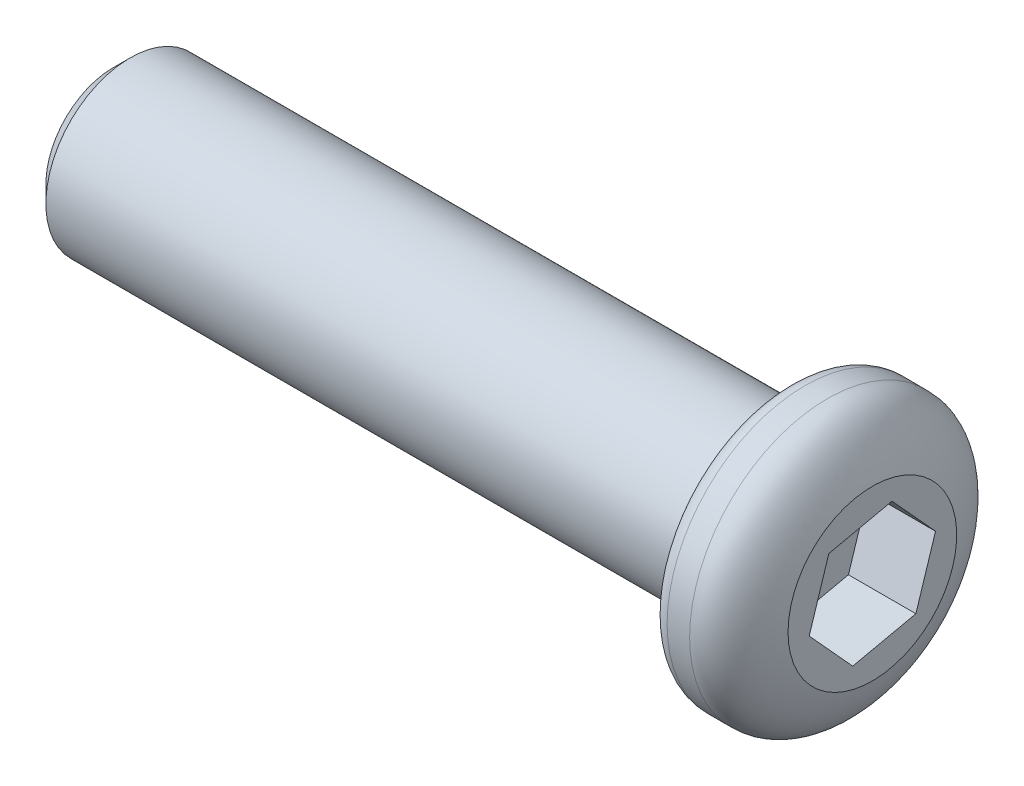
ISO-10303-21;
HEADER;
FILE_DESCRIPTION(('STEP AP214'),'2;1');
FILE_NAME('part.step','',(''),(''),'','','');
FILE_SCHEMA(('AUTOMOTIVE_DESIGN { 1 0 10303 214 1 1 1 1 }'));
ENDSEC;
DATA;
#1=APPLICATION_CONTEXT('core data for automotive mechanical design processes');
#2=APPLICATION_PROTOCOL_DEFINITION('international standard','automotive_design',2000,#1);
#3=PRODUCT_CONTEXT('',#1,'mechanical');
#4=PRODUCT('Part','Part','',(#3));
#5=PRODUCT_RELATED_PRODUCT_CATEGORY('part','',(#4));
#6=PRODUCT_DEFINITION_FORMATION('','',#4);
#7=PRODUCT_DEFINITION_CONTEXT('part definition',#1,'design');
#8=PRODUCT_DEFINITION('design','',#6,#7);
#9=PRODUCT_DEFINITION_SHAPE('','',#8);
#10=(LENGTH_UNIT() NAMED_UNIT(*) SI_UNIT(.MILLI.,.METRE.));
#11=(NAMED_UNIT(*) PLANE_ANGLE_UNIT() SI_UNIT($,.RADIAN.));
#12=(NAMED_UNIT(*) SI_UNIT($,.STERADIAN.) SOLID_ANGLE_UNIT());
#13=UNCERTAINTY_MEASURE_WITH_UNIT(LENGTH_MEASURE(1.E-05),#10,'distance_accuracy_value','');
#14=(GEOMETRIC_REPRESENTATION_CONTEXT(3) GLOBAL_UNCERTAINTY_ASSIGNED_CONTEXT((#13)) GLOBAL_UNIT_ASSIGNED_CONTEXT((#10,
#11,#12)) REPRESENTATION_CONTEXT('',''));
#15=CARTESIAN_POINT('',(0.,0.,0.));
#16=DIRECTION('',(0.,0.,1.));
#17=DIRECTION('',(1.,0.,0.));
#18=AXIS2_PLACEMENT_3D('',#15,#16,#17);
#19=CARTESIAN_POINT('',(13.5,0.,-1.5));
#20=DIRECTION('',(-1.,0.,0.));
#21=DIRECTION('',(0.,0.,1.));
#22=AXIS2_PLACEMENT_3D('',#19,#20,#21);
#23=PLANE('',#22);
#24=DIRECTION('',(0.,-0.213323623316259,0.976981592321587));
#25=VECTOR('',#24,1.);
#26=CARTESIAN_POINT('',(13.5,1.09566559308416,-0.349309187012806));
#27=LINE('',#26,#25);
#28=CARTESIAN_POINT('',(13.5,1.09566559308416,-0.349309187012806));
#29=VERTEX_POINT('',#28);
#30=CARTESIAN_POINT('',(13.5,0.850343426270457,0.774219644157019));
#31=VERTEX_POINT('',#30);
#32=EDGE_CURVE('E121',#29,#31,#27,.T.);
#33=ORIENTED_EDGE('',*,*,#32,.F.);
#34=DIRECTION('',(0.,0.739429066322136,0.673234473180016));
#35=VECTOR('',#34,1.);
#36=CARTESIAN_POINT('',(13.5,0.245322166813698,-1.12352883116982));
#37=LINE('',#36,#35);
#38=CARTESIAN_POINT('',(13.5,0.245322166813698,-1.12352883116982));
#39=VERTEX_POINT('',#38);
#40=EDGE_CURVE('E47',#39,#29,#37,.T.);
#41=ORIENTED_EDGE('',*,*,#40,.F.);
#42=DIRECTION('',(0.,0.952752689638395,-0.303747119141571));
#43=VECTOR('',#42,1.);
#44=CARTESIAN_POINT('',(13.5,-0.850343426270457,-0.774219644157018));
#45=LINE('',#44,#43);
#46=CARTESIAN_POINT('',(13.5,-0.850343426270457,-0.774219644157018));
#47=VERTEX_POINT('',#46);
#48=EDGE_CURVE('E130',#47,#39,#45,.T.);
#49=ORIENTED_EDGE('',*,*,#48,.F.);
#50=DIRECTION('',(0.,0.213323623316259,-0.976981592321587));
#51=VECTOR('',#50,1.);
#52=CARTESIAN_POINT('',(13.5,-1.09566559308415,0.349309187012806));
#53=LINE('',#52,#51);
#54=CARTESIAN_POINT('',(13.5,-1.09566559308415,0.349309187012806));
#55=VERTEX_POINT('',#54);
#56=EDGE_CURVE('E128',#55,#47,#53,.T.);
#57=ORIENTED_EDGE('',*,*,#56,.F.);
#58=DIRECTION('',(0.,-0.739429066322136,-0.673234473180016));
#59=VECTOR('',#58,1.);
#60=CARTESIAN_POINT('',(13.5,-0.245322166813698,1.12352883116982));
#61=LINE('',#60,#59);
#62=CARTESIAN_POINT('',(13.5,-0.245322166813698,1.12352883116982));
#63=VERTEX_POINT('',#62);
#64=EDGE_CURVE('E95',#63,#55,#61,.T.);
#65=ORIENTED_EDGE('',*,*,#64,.F.);
#66=DIRECTION('',(0.,-0.952752689638395,0.30374711914157));
#67=VECTOR('',#66,1.);
#68=CARTESIAN_POINT('',(13.5,0.850343426270457,0.774219644157019));
#69=LINE('',#68,#67);
#70=EDGE_CURVE('E124',#31,#63,#69,.T.);
#71=ORIENTED_EDGE('',*,*,#70,.F.);
#72=EDGE_LOOP('',(#33,#41,#49,#57,#65,#71));
#73=FACE_BOUND('',#72,.T.);
#74=CARTESIAN_POINT('',(13.5,0.,0.));
#75=DIRECTION('',(-1.,0.,0.));
#76=DIRECTION('',(0.,0.,1.));
#77=AXIS2_PLACEMENT_3D('',#74,#75,#76);
#78=CIRCLE('',#77,1.5);
#79=CARTESIAN_POINT('',(13.5,0.,1.5));
#80=VERTEX_POINT('',#79);
#81=EDGE_CURVE('E186',#80,#80,#78,.T.);
#82=ORIENTED_EDGE('',*,*,#81,.F.);
#83=EDGE_LOOP('',(#82));
#84=FACE_BOUND('',#83,.T.);
#85=ADVANCED_FACE('F32',(#73,#84),#23,.F.);
#86=CARTESIAN_POINT('',(13.5,0.,-1.5));
#87=CARTESIAN_POINT('',(13.1904427483468,0.,-2.48461827937574));
#88=CARTESIAN_POINT('',(12.7,0.,-2.45));
#89=B_SPLINE_CURVE_WITH_KNOTS('',2,(#86,#87,#88),.UNSPECIFIED.,.F.,.F.,(3,3),(0.,
0.615019669126218),.UNSPECIFIED.);
#90=CARTESIAN_POINT('',(-60.7109511079297,0.,0.));
#91=DIRECTION('',(-1.,0.,0.));
#92=AXIS1_PLACEMENT('',#90,#91);
#93=SURFACE_OF_REVOLUTION('',#89,#92);
#94=CARTESIAN_POINT('',(12.7,0.,0.));
#95=DIRECTION('',(-1.,0.,0.));
#96=DIRECTION('',(0.,0.,1.));
#97=AXIS2_PLACEMENT_3D('',#94,#95,#96);
#98=CIRCLE('',#97,2.45);
#99=CARTESIAN_POINT('',(12.7,0.,2.45));
#100=VERTEX_POINT('',#99);
#101=EDGE_CURVE('E134',#100,#100,#98,.T.);
#102=ORIENTED_EDGE('',*,*,#101,.F.);
#103=EDGE_LOOP('',(#102));
#104=FACE_BOUND('',#103,.T.);
#105=ORIENTED_EDGE('',*,*,#81,.T.);
#106=EDGE_LOOP('',(#105));
#107=FACE_BOUND('',#106,.T.);
#108=ADVANCED_FACE('F149',(#104,#107),#93,.T.);
#109=CARTESIAN_POINT('',(-60.7109511079297,0.,0.));
#110=DIRECTION('',(-1.,0.,0.));
#111=DIRECTION('',(0.,0.,1.));
#112=AXIS2_PLACEMENT_3D('',#109,#110,#111);
#113=CYLINDRICAL_SURFACE('',#112,2.45);
#114=CARTESIAN_POINT('',(12.3,0.,0.));
#115=DIRECTION('',(1.,0.,0.));
#116=DIRECTION('',(0.,0.,-1.));
#117=AXIS2_PLACEMENT_3D('',#114,#115,#116);
#118=CIRCLE('',#117,2.45);
#119=CARTESIAN_POINT('',(12.3,0.,-2.45));
#120=VERTEX_POINT('',#119);
#121=EDGE_CURVE('E11',#120,#120,#118,.T.);
#122=ORIENTED_EDGE('',*,*,#121,.T.);
#123=EDGE_LOOP('',(#122));
#124=FACE_BOUND('',#123,.T.);
#125=ORIENTED_EDGE('',*,*,#101,.T.);
#126=EDGE_LOOP('',(#125));
#127=FACE_BOUND('',#126,.T.);
#128=ADVANCED_FACE('F153',(#124,#127),#113,.T.);
#129=CARTESIAN_POINT('',(12.,0.,-1.5));
#130=DIRECTION('',(1.,0.,0.));
#131=DIRECTION('',(0.,0.,-1.));
#132=AXIS2_PLACEMENT_3D('',#129,#130,#131);
#133=PLANE('',#132);
#134=CARTESIAN_POINT('',(12.,0.,0.));
#135=DIRECTION('',(1.,0.,0.));
#136=DIRECTION('',(0.,0.,-1.));
#137=AXIS2_PLACEMENT_3D('',#134,#135,#136);
#138=CIRCLE('',#137,2.15);
#139=CARTESIAN_POINT('',(12.,0.,-2.15));
#140=VERTEX_POINT('',#139);
#141=EDGE_CURVE('E40',#140,#140,#138,.F.);
#142=ORIENTED_EDGE('',*,*,#141,.T.);
#143=EDGE_LOOP('',(#142));
#144=FACE_BOUND('',#143,.T.);
#145=CARTESIAN_POINT('',(12.,0.,0.));
#146=DIRECTION('',(1.,0.,0.));
#147=DIRECTION('',(0.,0.,-1.));
#148=AXIS2_PLACEMENT_3D('',#145,#146,#147);
#149=CIRCLE('',#148,1.80000000000001);
#150=CARTESIAN_POINT('',(12.,0.,-1.80000000000001));
#151=VERTEX_POINT('',#150);
#152=EDGE_CURVE('E177',#151,#151,#149,.T.);
#153=ORIENTED_EDGE('',*,*,#152,.T.);
#154=EDGE_LOOP('',(#153));
#155=FACE_BOUND('',#154,.T.);
#156=ADVANCED_FACE('F194',(#144,#155),#133,.F.);
#157=CARTESIAN_POINT('',(-60.7109511079297,0.,0.));
#158=DIRECTION('',(-1.,0.,0.));
#159=DIRECTION('',(0.,0.,1.));
#160=AXIS2_PLACEMENT_3D('',#157,#158,#159);
#161=CYLINDRICAL_SURFACE('',#160,1.5);
#162=CARTESIAN_POINT('',(11.7,0.,0.));
#163=DIRECTION('',(1.,0.,0.));
#164=DIRECTION('',(0.,0.,-1.));
#165=AXIS2_PLACEMENT_3D('',#162,#163,#164);
#166=CIRCLE('',#165,1.5);
#167=CARTESIAN_POINT('',(11.7,0.,-1.5));
#168=VERTEX_POINT('',#167);
#169=EDGE_CURVE('E181',#168,#168,#166,.F.);
#170=ORIENTED_EDGE('',*,*,#169,.T.);
#171=EDGE_LOOP('',(#170));
#172=FACE_BOUND('',#171,.T.);
#173=CARTESIAN_POINT('',(0.300000000000002,0.,0.));
#174=DIRECTION('',(1.,0.,0.));
#175=DIRECTION('',(0.,0.,-1.));
#176=AXIS2_PLACEMENT_3D('',#173,#174,#175);
#177=CIRCLE('',#176,1.5);
#178=CARTESIAN_POINT('',(0.300000000000002,0.,-1.5));
#179=VERTEX_POINT('',#178);
#180=EDGE_CURVE('E172',#179,#179,#177,.T.);
#181=ORIENTED_EDGE('',*,*,#180,.T.);
#182=EDGE_LOOP('',(#181));
#183=FACE_BOUND('',#182,.T.);
#184=ADVANCED_FACE('F199',(#172,#183),#161,.T.);
#185=CARTESIAN_POINT('',(0.,0.,0.));
#186=DIRECTION('',(1.,0.,0.));
#187=DIRECTION('',(0.,0.,-1.));
#188=AXIS2_PLACEMENT_3D('',#185,#186,#187);
#189=PLANE('',#188);
#190=CARTESIAN_POINT('',(0.,0.,0.));
#191=DIRECTION('',(1.,0.,0.));
#192=DIRECTION('',(0.,0.,-1.));
#193=AXIS2_PLACEMENT_3D('',#190,#191,#192);
#194=CIRCLE('',#193,1.2);
#195=CARTESIAN_POINT('',(0.,0.,-1.2));
#196=VERTEX_POINT('',#195);
#197=EDGE_CURVE('E175',#196,#196,#194,.F.);
#198=ORIENTED_EDGE('',*,*,#197,.T.);
#199=EDGE_LOOP('',(#198));
#200=FACE_BOUND('',#199,.T.);
#201=ADVANCED_FACE('F211',(#200),#189,.F.);
#202=CARTESIAN_POINT('',(12.3,0.245322166813698,-1.12352883116982));
#203=DIRECTION('',(0.,0.673234473180016,-0.739429066322136));
#204=DIRECTION('',(0.,0.739429066322136,0.673234473180016));
#205=AXIS2_PLACEMENT_3D('',#202,#203,#204);
#206=PLANE('',#205);
#207=ORIENTED_EDGE('',*,*,#40,.T.);
#208=DIRECTION('',(1.,0.,0.));
#209=VECTOR('',#208,1.);
#210=CARTESIAN_POINT('',(12.3,1.09566559308416,-0.349309187012806));
#211=LINE('',#210,#209);
#212=CARTESIAN_POINT('',(12.3,1.09566559308416,-0.349309187012806));
#213=VERTEX_POINT('',#212);
#214=EDGE_CURVE('E77',#213,#29,#211,.T.);
#215=ORIENTED_EDGE('',*,*,#214,.F.);
#216=DIRECTION('',(0.,0.739429066322136,0.673234473180016));
#217=VECTOR('',#216,1.);
#218=CARTESIAN_POINT('',(12.3,0.245322166813698,-1.12352883116982));
#219=LINE('',#218,#217);
#220=CARTESIAN_POINT('',(12.3,0.245322166813698,-1.12352883116982));
#221=VERTEX_POINT('',#220);
#222=EDGE_CURVE('E132',#221,#213,#219,.T.);
#223=ORIENTED_EDGE('',*,*,#222,.F.);
#224=DIRECTION('',(1.,0.,0.));
#225=VECTOR('',#224,1.);
#226=CARTESIAN_POINT('',(12.3,0.245322166813698,-1.12352883116982));
#227=LINE('',#226,#225);
#228=EDGE_CURVE('E55',#221,#39,#227,.T.);
#229=ORIENTED_EDGE('',*,*,#228,.T.);
#230=EDGE_LOOP('',(#207,#215,#223,#229));
#231=FACE_BOUND('',#230,.T.);
#232=ADVANCED_FACE('F216',(#231),#206,.F.);
#233=CARTESIAN_POINT('',(12.3,-0.850343426270457,-0.774219644157018));
#234=DIRECTION('',(0.,-0.303747119141571,-0.952752689638395));
#235=DIRECTION('',(0.,0.952752689638396,-0.303747119141571));
#236=AXIS2_PLACEMENT_3D('',#233,#234,#235);
#237=PLANE('',#236);
#238=ORIENTED_EDGE('',*,*,#48,.T.);
#239=ORIENTED_EDGE('',*,*,#228,.F.);
#240=DIRECTION('',(0.,0.952752689638395,-0.303747119141571));
#241=VECTOR('',#240,1.);
#242=CARTESIAN_POINT('',(12.3,-0.850343426270457,-0.774219644157018));
#243=LINE('',#242,#241);
#244=CARTESIAN_POINT('',(12.3,-0.850343426270457,-0.774219644157018));
#245=VERTEX_POINT('',#244);
#246=EDGE_CURVE('E107',#245,#221,#243,.T.);
#247=ORIENTED_EDGE('',*,*,#246,.F.);
#248=DIRECTION('',(1.,0.,0.));
#249=VECTOR('',#248,1.);
#250=CARTESIAN_POINT('',(12.3,-0.850343426270457,-0.774219644157018));
#251=LINE('',#250,#249);
#252=EDGE_CURVE('E99',#245,#47,#251,.T.);
#253=ORIENTED_EDGE('',*,*,#252,.T.);
#254=EDGE_LOOP('',(#238,#239,#247,#253));
#255=FACE_BOUND('',#254,.T.);
#256=ADVANCED_FACE('F221',(#255),#237,.F.);
#257=CARTESIAN_POINT('',(12.3,-1.09566559308415,0.349309187012806));
#258=DIRECTION('',(0.,-0.976981592321587,-0.213323623316259));
#259=DIRECTION('',(0.,0.213323623316259,-0.976981592321587));
#260=AXIS2_PLACEMENT_3D('',#257,#258,#259);
#261=PLANE('',#260);
#262=ORIENTED_EDGE('',*,*,#56,.T.);
#263=ORIENTED_EDGE('',*,*,#252,.F.);
#264=DIRECTION('',(0.,0.213323623316259,-0.976981592321587));
#265=VECTOR('',#264,1.);
#266=CARTESIAN_POINT('',(12.3,-1.09566559308415,0.349309187012806));
#267=LINE('',#266,#265);
#268=CARTESIAN_POINT('',(12.3,-1.09566559308415,0.349309187012806));
#269=VERTEX_POINT('',#268);
#270=EDGE_CURVE('E103',#269,#245,#267,.T.);
#271=ORIENTED_EDGE('',*,*,#270,.F.);
#272=DIRECTION('',(1.,0.,0.));
#273=VECTOR('',#272,1.);
#274=CARTESIAN_POINT('',(12.3,-1.09566559308415,0.349309187012806));
#275=LINE('',#274,#273);
#276=EDGE_CURVE('E88',#269,#55,#275,.T.);
#277=ORIENTED_EDGE('',*,*,#276,.T.);
#278=EDGE_LOOP('',(#262,#263,#271,#277));
#279=FACE_BOUND('',#278,.T.);
#280=ADVANCED_FACE('F104',(#279),#261,.F.);
#281=CARTESIAN_POINT('',(12.3,-0.245322166813698,1.12352883116982));
#282=DIRECTION('',(0.,-0.673234473180016,0.739429066322136));
#283=DIRECTION('',(0.,-0.739429066322136,-0.673234473180016));
#284=AXIS2_PLACEMENT_3D('',#281,#282,#283);
#285=PLANE('',#284);
#286=ORIENTED_EDGE('',*,*,#64,.T.);
#287=ORIENTED_EDGE('',*,*,#276,.F.);
#288=DIRECTION('',(0.,-0.739429066322136,-0.673234473180016));
#289=VECTOR('',#288,1.);
#290=CARTESIAN_POINT('',(12.3,-0.245322166813698,1.12352883116982));
#291=LINE('',#290,#289);
#292=CARTESIAN_POINT('',(12.3,-0.245322166813698,1.12352883116982));
#293=VERTEX_POINT('',#292);
#294=EDGE_CURVE('E92',#293,#269,#291,.T.);
#295=ORIENTED_EDGE('',*,*,#294,.F.);
#296=DIRECTION('',(1.,0.,0.));
#297=VECTOR('',#296,1.);
#298=CARTESIAN_POINT('',(12.3,-0.245322166813698,1.12352883116982));
#299=LINE('',#298,#297);
#300=EDGE_CURVE('E100',#293,#63,#299,.T.);
#301=ORIENTED_EDGE('',*,*,#300,.T.);
#302=EDGE_LOOP('',(#286,#287,#295,#301));
#303=FACE_BOUND('',#302,.T.);
#304=ADVANCED_FACE('F90',(#303),#285,.F.);
#305=CARTESIAN_POINT('',(12.3,0.850343426270457,0.774219644157019));
#306=DIRECTION('',(0.,0.30374711914157,0.952752689638395));
#307=DIRECTION('',(0.,-0.952752689638396,0.30374711914157));
#308=AXIS2_PLACEMENT_3D('',#305,#306,#307);
#309=PLANE('',#308);
#310=ORIENTED_EDGE('',*,*,#70,.T.);
#311=ORIENTED_EDGE('',*,*,#300,.F.);
#312=DIRECTION('',(0.,-0.952752689638395,0.30374711914157));
#313=VECTOR('',#312,1.);
#314=CARTESIAN_POINT('',(12.3,0.850343426270457,0.774219644157019));
#315=LINE('',#314,#313);
#316=CARTESIAN_POINT('',(12.3,0.850343426270457,0.774219644157019));
#317=VERTEX_POINT('',#316);
#318=EDGE_CURVE('E113',#317,#293,#315,.T.);
#319=ORIENTED_EDGE('',*,*,#318,.F.);
#320=DIRECTION('',(1.,0.,0.));
#321=VECTOR('',#320,1.);
#322=CARTESIAN_POINT('',(12.3,0.850343426270457,0.774219644157019));
#323=LINE('',#322,#321);
#324=EDGE_CURVE('E137',#317,#31,#323,.T.);
#325=ORIENTED_EDGE('',*,*,#324,.T.);
#326=EDGE_LOOP('',(#310,#311,#319,#325));
#327=FACE_BOUND('',#326,.T.);
#328=ADVANCED_FACE('F225',(#327),#309,.F.);
#329=CARTESIAN_POINT('',(12.3,1.09566559308416,-0.349309187012806));
#330=DIRECTION('',(0.,0.976981592321587,0.213323623316259));
#331=DIRECTION('',(0.,-0.213323623316259,0.976981592321587));
#332=AXIS2_PLACEMENT_3D('',#329,#330,#331);
#333=PLANE('',#332);
#334=ORIENTED_EDGE('',*,*,#32,.T.);
#335=ORIENTED_EDGE('',*,*,#324,.F.);
#336=DIRECTION('',(0.,-0.213323623316259,0.976981592321587));
#337=VECTOR('',#336,1.);
#338=CARTESIAN_POINT('',(12.3,1.09566559308416,-0.349309187012806));
#339=LINE('',#338,#337);
#340=EDGE_CURVE('E115',#213,#317,#339,.T.);
#341=ORIENTED_EDGE('',*,*,#340,.F.);
#342=ORIENTED_EDGE('',*,*,#214,.T.);
#343=EDGE_LOOP('',(#334,#335,#341,#342));
#344=FACE_BOUND('',#343,.T.);
#345=ADVANCED_FACE('F222',(#344),#333,.F.);
#346=CARTESIAN_POINT('',(12.3,0.,0.));
#347=DIRECTION('',(1.,0.,0.));
#348=DIRECTION('',(0.,0.,-1.));
#349=AXIS2_PLACEMENT_3D('',#346,#347,#348);
#350=PLANE('',#349);
#351=ORIENTED_EDGE('',*,*,#222,.T.);
#352=ORIENTED_EDGE('',*,*,#340,.T.);
#353=ORIENTED_EDGE('',*,*,#318,.T.);
#354=ORIENTED_EDGE('',*,*,#294,.T.);
#355=ORIENTED_EDGE('',*,*,#270,.T.);
#356=ORIENTED_EDGE('',*,*,#246,.T.);
#357=EDGE_LOOP('',(#351,#352,#353,#354,#355,#356));
#358=FACE_BOUND('',#357,.T.);
#359=ADVANCED_FACE('F110',(#358),#350,.T.);
#360=CARTESIAN_POINT('',(11.7,0.,0.));
#361=DIRECTION('',(1.,0.,0.));
#362=DIRECTION('',(0.,0.,-1.));
#363=AXIS2_PLACEMENT_3D('',#360,#361,#362);
#364=CONICAL_SURFACE('',#363,1.5,0.78539816339745);
#365=ORIENTED_EDGE('',*,*,#152,.F.);
#366=EDGE_LOOP('',(#365));
#367=FACE_BOUND('',#366,.T.);
#368=ORIENTED_EDGE('',*,*,#169,.F.);
#369=EDGE_LOOP('',(#368));
#370=FACE_BOUND('',#369,.T.);
#371=ADVANCED_FACE('F159',(#367,#370),#364,.T.);
#372=CARTESIAN_POINT('',(0.,0.,0.));
#373=DIRECTION('',(1.,0.,0.));
#374=DIRECTION('',(0.,0.,-1.));
#375=AXIS2_PLACEMENT_3D('',#372,#373,#374);
#376=CONICAL_SURFACE('',#375,1.2,0.785398163397446);
#377=ORIENTED_EDGE('',*,*,#180,.F.);
#378=EDGE_LOOP('',(#377));
#379=FACE_BOUND('',#378,.T.);
#380=ORIENTED_EDGE('',*,*,#197,.F.);
#381=EDGE_LOOP('',(#380));
#382=FACE_BOUND('',#381,.T.);
#383=ADVANCED_FACE('F161',(#379,#382),#376,.T.);
#384=CARTESIAN_POINT('',(12.3,0.,0.));
#385=DIRECTION('',(1.,0.,0.));
#386=DIRECTION('',(0.,0.,-1.));
#387=AXIS2_PLACEMENT_3D('',#384,#385,#386);
#388=TOROIDAL_SURFACE('',#387,2.15,0.3);
#389=ORIENTED_EDGE('',*,*,#121,.F.);
#390=EDGE_LOOP('',(#389));
#391=FACE_BOUND('',#390,.T.);
#392=ORIENTED_EDGE('',*,*,#141,.F.);
#393=EDGE_LOOP('',(#392));
#394=FACE_BOUND('',#393,.T.);
#395=ADVANCED_FACE('F34',(#391,#394),#388,.T.);
#396=CLOSED_SHELL('',(#85,#108,#128,#156,#184,#201,#232,#256,#280,#304,#328,#345,#359,#371,#383,#395));
#397=MANIFOLD_SOLID_BREP('B2',#396);
#398=ADVANCED_BREP_SHAPE_REPRESENTATION('',(#18,#397),#14);
#399=SHAPE_DEFINITION_REPRESENTATION(#9,#398);
ENDSEC;
END-ISO-10303-21;
